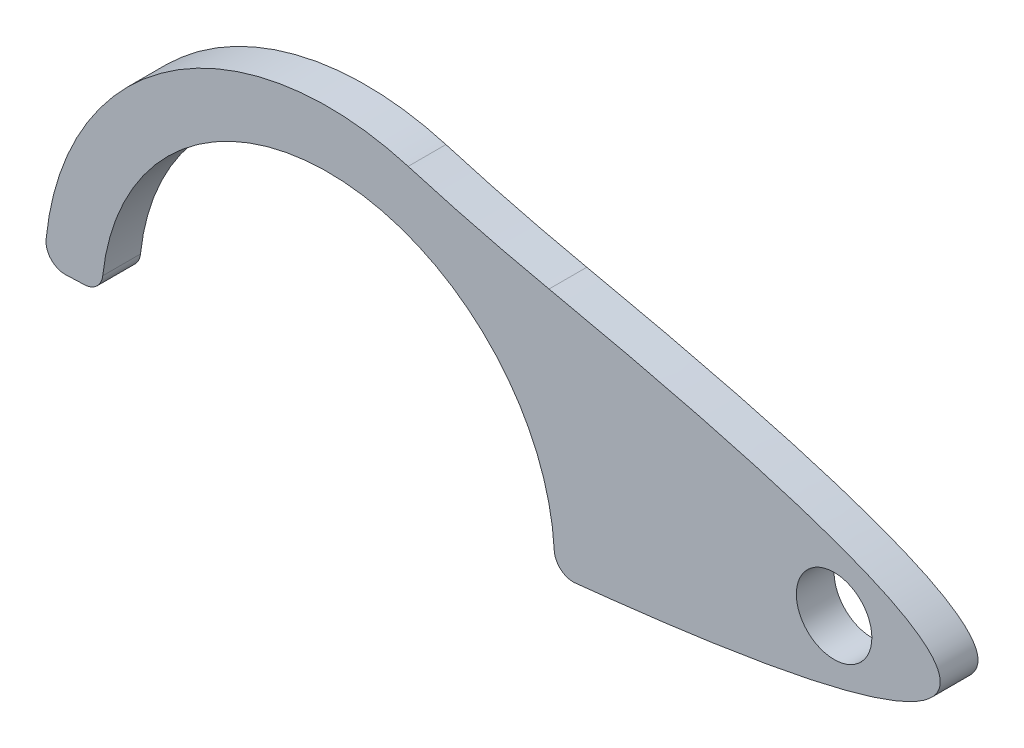
ISO-10303-21;
HEADER;
FILE_DESCRIPTION(('STEP AP214'),'2;1');
FILE_NAME('part.step','',(''),(''),'','','');
FILE_SCHEMA(('AUTOMOTIVE_DESIGN { 1 0 10303 214 1 1 1 1 }'));
ENDSEC;
DATA;
#1=APPLICATION_CONTEXT('core data for automotive mechanical design processes');
#2=APPLICATION_PROTOCOL_DEFINITION('international standard','automotive_design',2000,#1);
#3=PRODUCT_CONTEXT('',#1,'mechanical');
#4=PRODUCT('Part','Part','',(#3));
#5=PRODUCT_RELATED_PRODUCT_CATEGORY('part','',(#4));
#6=PRODUCT_DEFINITION_FORMATION('','',#4);
#7=PRODUCT_DEFINITION_CONTEXT('part definition',#1,'design');
#8=PRODUCT_DEFINITION('design','',#6,#7);
#9=PRODUCT_DEFINITION_SHAPE('','',#8);
#10=(LENGTH_UNIT() NAMED_UNIT(*) SI_UNIT(.MILLI.,.METRE.));
#11=(NAMED_UNIT(*) PLANE_ANGLE_UNIT() SI_UNIT($,.RADIAN.));
#12=(NAMED_UNIT(*) SI_UNIT($,.STERADIAN.) SOLID_ANGLE_UNIT());
#13=UNCERTAINTY_MEASURE_WITH_UNIT(LENGTH_MEASURE(1.E-05),#10,'distance_accuracy_value','');
#14=(GEOMETRIC_REPRESENTATION_CONTEXT(3) GLOBAL_UNCERTAINTY_ASSIGNED_CONTEXT((#13)) GLOBAL_UNIT_ASSIGNED_CONTEXT((#10,
#11,#12)) REPRESENTATION_CONTEXT('',''));
#15=CARTESIAN_POINT('',(0.,0.,0.));
#16=DIRECTION('',(0.,0.,1.));
#17=DIRECTION('',(1.,0.,0.));
#18=AXIS2_PLACEMENT_3D('',#15,#16,#17);
#19=CARTESIAN_POINT('',(6.35374235912783,13.5878606864298,2.));
#20=CARTESIAN_POINT('',(53.7396310244837,4.25584160131257,2.));
#21=CARTESIAN_POINT('',(14.9997289989865,-0.0901662739814048,2.));
#22=B_SPLINE_CURVE_WITH_KNOTS('',2,(#19,#20,#21),.UNSPECIFIED.,.F.,.F.,(3,3),(0.,1.),.UNSPECIFIED.);
#23=DIRECTION('',(0.,0.,-1.));
#24=VECTOR('',#23,1.);
#25=SURFACE_OF_LINEAR_EXTRUSION('',#22,#24);
#26=CARTESIAN_POINT('',(6.35374235912783,13.5878606864298,0.));
#27=CARTESIAN_POINT('',(53.7396310244837,4.25584160131257,0.));
#28=CARTESIAN_POINT('',(14.9997289989865,-0.0901662739814048,0.));
#29=B_SPLINE_CURVE_WITH_KNOTS('',2,(#26,#27,#28),.UNSPECIFIED.,.F.,.F.,(3,3),(0.,1.),.UNSPECIFIED.);
#30=CARTESIAN_POINT('',(11.7064313687259,12.4910088121295,0.));
#31=VERTEX_POINT('',#30);
#32=CARTESIAN_POINT('',(14.9997289989865,-0.0901662739814051,0.));
#33=VERTEX_POINT('',#32);
#34=EDGE_CURVE('E174',#31,#33,#29,.T.);
#35=ORIENTED_EDGE('',*,*,#34,.F.);
#36=DIRECTION('',(0.,0.,-1.));
#37=VECTOR('',#36,1.);
#38=CARTESIAN_POINT('',(11.7064313687292,12.4910088121288,0.));
#39=LINE('',#38,#37);
#40=CARTESIAN_POINT('',(11.7064313687259,12.4910088121295,2.));
#41=VERTEX_POINT('',#40);
#42=EDGE_CURVE('E49',#31,#41,#39,.F.);
#43=ORIENTED_EDGE('',*,*,#42,.T.);
#44=CARTESIAN_POINT('',(14.9997289989865,-0.0901662739814051,2.));
#45=VERTEX_POINT('',#44);
#46=EDGE_CURVE('E101',#41,#45,#22,.T.);
#47=ORIENTED_EDGE('',*,*,#46,.T.);
#48=DIRECTION('',(0.,0.,-1.));
#49=VECTOR('',#48,1.);
#50=CARTESIAN_POINT('',(14.9997289989865,-0.0901662739814051,2.));
#51=LINE('',#50,#49);
#52=EDGE_CURVE('E104',#45,#33,#51,.T.);
#53=ORIENTED_EDGE('',*,*,#52,.T.);
#54=EDGE_LOOP('',(#35,#43,#47,#53));
#55=FACE_BOUND('',#54,.T.);
#56=ADVANCED_FACE('F34',(#55),#25,.T.);
#57=CARTESIAN_POINT('',(0.,0.,2.));
#58=DIRECTION('',(0.,0.,-1.));
#59=DIRECTION('',(-1.,0.,0.));
#60=AXIS2_PLACEMENT_3D('',#57,#58,#59);
#61=CYLINDRICAL_SURFACE('',#60,15.);
#62=CARTESIAN_POINT('',(0.,0.,2.));
#63=DIRECTION('',(0.,0.,1.));
#64=DIRECTION('',(1.,0.,0.));
#65=AXIS2_PLACEMENT_3D('',#62,#63,#64);
#66=CIRCLE('',#65,15.);
#67=CARTESIAN_POINT('',(4.24517189125964,14.3867479165258,2.));
#68=VERTEX_POINT('',#67);
#69=CARTESIAN_POINT('',(-14.9303838398989,1.44348134497323,2.));
#70=VERTEX_POINT('',#69);
#71=EDGE_CURVE('E107',#68,#70,#66,.T.);
#72=ORIENTED_EDGE('',*,*,#71,.F.);
#73=DIRECTION('',(0.,0.,-1.));
#74=VECTOR('',#73,1.);
#75=CARTESIAN_POINT('',(4.24517189125964,14.3867479165258,2.));
#76=LINE('',#75,#74);
#77=CARTESIAN_POINT('',(4.24517189125964,14.3867479165258,0.));
#78=VERTEX_POINT('',#77);
#79=EDGE_CURVE('E160',#68,#78,#76,.T.);
#80=ORIENTED_EDGE('',*,*,#79,.T.);
#81=CARTESIAN_POINT('',(0.,0.,0.));
#82=DIRECTION('',(0.,0.,1.));
#83=DIRECTION('',(1.,0.,0.));
#84=AXIS2_PLACEMENT_3D('',#81,#82,#83);
#85=CIRCLE('',#84,15.);
#86=CARTESIAN_POINT('',(-14.9303838398989,1.44348134497323,0.));
#87=VERTEX_POINT('',#86);
#88=EDGE_CURVE('E167',#78,#87,#85,.T.);
#89=ORIENTED_EDGE('',*,*,#88,.T.);
#90=DIRECTION('',(0.,0.,-1.));
#91=VECTOR('',#90,1.);
#92=CARTESIAN_POINT('',(-14.9303838398989,1.44348134497323,2.));
#93=LINE('',#92,#91);
#94=EDGE_CURVE('E157',#87,#70,#93,.F.);
#95=ORIENTED_EDGE('',*,*,#94,.T.);
#96=EDGE_LOOP('',(#72,#80,#89,#95));
#97=FACE_BOUND('',#96,.T.);
#98=ADVANCED_FACE('F166',(#97),#61,.T.);
#99=CARTESIAN_POINT('',(-0.0327826563408831,0.870245535865194,2.));
#100=DIRECTION('',(-0.0376438823641468,0.999291217874226,0.));
#101=DIRECTION('',(-0.999291217874226,-0.0376438823641468,0.));
#102=AXIS2_PLACEMENT_3D('',#99,#100,#101);
#103=PLANE('',#102);
#104=DIRECTION('',(0.999291217874226,0.0376438823641468,0.));
#105=VECTOR('',#104,1.);
#106=CARTESIAN_POINT('',(-0.0327826563408831,0.870245535865194,0.));
#107=LINE('',#106,#105);
#108=CARTESIAN_POINT('',(-13.8973810348748,0.347958037434119,0.));
#109=VERTEX_POINT('',#108);
#110=CARTESIAN_POINT('',(-12.8883397764657,0.385969209505588,0.));
#111=VERTEX_POINT('',#110);
#112=EDGE_CURVE('E173',#109,#111,#107,.T.);
#113=ORIENTED_EDGE('',*,*,#112,.T.);
#114=DIRECTION('',(0.,0.,1.));
#115=VECTOR('',#114,1.);
#116=CARTESIAN_POINT('',(-12.8883397764657,0.385969209505588,2.));
#117=LINE('',#116,#115);
#118=CARTESIAN_POINT('',(-12.8883397764657,0.385969209505588,2.));
#119=VERTEX_POINT('',#118);
#120=EDGE_CURVE('E155',#111,#119,#117,.T.);
#121=ORIENTED_EDGE('',*,*,#120,.T.);
#122=DIRECTION('',(0.999291217874226,0.0376438823641468,0.));
#123=VECTOR('',#122,1.);
#124=CARTESIAN_POINT('',(-0.0327826563408831,0.870245535865194,2.));
#125=LINE('',#124,#123);
#126=CARTESIAN_POINT('',(-13.8973810348748,0.347958037434119,2.));
#127=VERTEX_POINT('',#126);
#128=EDGE_CURVE('E218',#127,#119,#125,.T.);
#129=ORIENTED_EDGE('',*,*,#128,.F.);
#130=DIRECTION('',(0.,0.,-1.));
#131=VECTOR('',#130,1.);
#132=CARTESIAN_POINT('',(-13.8973810348748,0.347958037434119,2.));
#133=LINE('',#132,#131);
#134=EDGE_CURVE('E152',#127,#109,#133,.T.);
#135=ORIENTED_EDGE('',*,*,#134,.T.);
#136=EDGE_LOOP('',(#113,#121,#129,#135));
#137=FACE_BOUND('',#136,.T.);
#138=ADVANCED_FACE('F204',(#137),#103,.F.);
#139=CARTESIAN_POINT('',(0.,0.,2.));
#140=DIRECTION('',(0.,0.,-1.));
#141=DIRECTION('',(-1.,0.,0.));
#142=AXIS2_PLACEMENT_3D('',#139,#140,#141);
#143=CYLINDRICAL_SURFACE('',#142,12.);
#144=CARTESIAN_POINT('',(0.,0.,0.));
#145=DIRECTION('',(0.,0.,1.));
#146=DIRECTION('',(1.,0.,0.));
#147=AXIS2_PLACEMENT_3D('',#144,#145,#146);
#148=CIRCLE('',#147,12.);
#149=CARTESIAN_POINT('',(11.982856899948,0.641202398130928,0.));
#150=VERTEX_POINT('',#149);
#151=CARTESIAN_POINT('',(-11.9316772235352,1.27870193296598,0.));
#152=VERTEX_POINT('',#151);
#153=EDGE_CURVE('E177',#150,#152,#148,.T.);
#154=ORIENTED_EDGE('',*,*,#153,.F.);
#155=DIRECTION('',(0.,0.,-1.));
#156=VECTOR('',#155,1.);
#157=CARTESIAN_POINT('',(11.982856899948,0.641202398130929,2.));
#158=LINE('',#157,#156);
#159=CARTESIAN_POINT('',(11.982856899948,0.641202398130928,2.));
#160=VERTEX_POINT('',#159);
#161=EDGE_CURVE('E145',#150,#160,#158,.F.);
#162=ORIENTED_EDGE('',*,*,#161,.T.);
#163=CARTESIAN_POINT('',(0.,0.,2.));
#164=DIRECTION('',(0.,0.,1.));
#165=DIRECTION('',(1.,0.,0.));
#166=AXIS2_PLACEMENT_3D('',#163,#164,#165);
#167=CIRCLE('',#166,12.);
#168=CARTESIAN_POINT('',(-11.9316772235352,1.27870193296598,2.));
#169=VERTEX_POINT('',#168);
#170=EDGE_CURVE('E121',#160,#169,#167,.T.);
#171=ORIENTED_EDGE('',*,*,#170,.T.);
#172=DIRECTION('',(0.,0.,-1.));
#173=VECTOR('',#172,1.);
#174=CARTESIAN_POINT('',(-11.9316772235352,1.27870193296598,2.));
#175=LINE('',#174,#173);
#176=EDGE_CURVE('E142',#169,#152,#175,.T.);
#177=ORIENTED_EDGE('',*,*,#176,.T.);
#178=EDGE_LOOP('',(#154,#162,#171,#177));
#179=FACE_BOUND('',#178,.T.);
#180=ADVANCED_FACE('F196',(#179),#143,.F.);
#181=CARTESIAN_POINT('',(0.187771210601942,-1.71340317060258,2.));
#182=DIRECTION('',(-0.108937414245944,0.994048610369437,0.));
#183=DIRECTION('',(-0.994048610369437,-0.108937414245944,0.));
#184=AXIS2_PLACEMENT_3D('',#181,#182,#183);
#185=PLANE('',#184);
#186=DIRECTION('',(0.994048610369436,0.108937414245944,0.));
#187=VECTOR('',#186,1.);
#188=CARTESIAN_POINT('',(0.187771210601942,-1.71340317060258,2.));
#189=LINE('',#188,#187);
#190=CARTESIAN_POINT('',(13.0903657225229,-0.299412679060931,2.));
#191=VERTEX_POINT('',#190);
#192=EDGE_CURVE('E111',#191,#45,#189,.T.);
#193=ORIENTED_EDGE('',*,*,#192,.F.);
#194=DIRECTION('',(0.,0.,1.));
#195=VECTOR('',#194,1.);
#196=CARTESIAN_POINT('',(13.0903657225229,-0.299412679060931,0.));
#197=LINE('',#196,#195);
#198=CARTESIAN_POINT('',(13.0903657225229,-0.299412679060931,0.));
#199=VERTEX_POINT('',#198);
#200=EDGE_CURVE('E127',#191,#199,#197,.F.);
#201=ORIENTED_EDGE('',*,*,#200,.T.);
#202=DIRECTION('',(0.994048610369436,0.108937414245944,0.));
#203=VECTOR('',#202,1.);
#204=CARTESIAN_POINT('',(0.187771210601942,-1.71340317060258,0.));
#205=LINE('',#204,#203);
#206=EDGE_CURVE('E126',#199,#33,#205,.T.);
#207=ORIENTED_EDGE('',*,*,#206,.T.);
#208=ORIENTED_EDGE('',*,*,#52,.F.);
#209=EDGE_LOOP('',(#193,#201,#207,#208));
#210=FACE_BOUND('',#209,.T.);
#211=ADVANCED_FACE('F124',(#210),#185,.F.);
#212=CARTESIAN_POINT('',(26.8036076870909,5.04867041357118,2.));
#213=DIRECTION('',(0.,0.,-1.));
#214=DIRECTION('',(-1.,0.,0.));
#215=AXIS2_PLACEMENT_3D('',#212,#213,#214);
#216=CYLINDRICAL_SURFACE('',#215,2.);
#217=CARTESIAN_POINT('',(26.8036076870909,5.04867041357118,2.));
#218=DIRECTION('',(0.,0.,1.));
#219=DIRECTION('',(1.,0.,0.));
#220=AXIS2_PLACEMENT_3D('',#217,#218,#219);
#221=CIRCLE('',#220,2.);
#222=CARTESIAN_POINT('',(28.8036076870909,5.04867041357118,2.));
#223=VERTEX_POINT('',#222);
#224=EDGE_CURVE('E120',#223,#223,#221,.T.);
#225=ORIENTED_EDGE('',*,*,#224,.T.);
#226=EDGE_LOOP('',(#225));
#227=FACE_BOUND('',#226,.T.);
#228=CARTESIAN_POINT('',(26.8036076870909,5.04867041357118,0.));
#229=DIRECTION('',(0.,0.,1.));
#230=DIRECTION('',(1.,0.,0.));
#231=AXIS2_PLACEMENT_3D('',#228,#229,#230);
#232=CIRCLE('',#231,2.);
#233=CARTESIAN_POINT('',(28.8036076870909,5.04867041357118,0.));
#234=VERTEX_POINT('',#233);
#235=EDGE_CURVE('E108',#234,#234,#232,.T.);
#236=ORIENTED_EDGE('',*,*,#235,.F.);
#237=EDGE_LOOP('',(#236));
#238=FACE_BOUND('',#237,.T.);
#239=ADVANCED_FACE('F187',(#227,#238),#216,.F.);
#240=CARTESIAN_POINT('',(0.,0.,2.));
#241=DIRECTION('',(0.,0.,1.));
#242=DIRECTION('',(1.,0.,0.));
#243=AXIS2_PLACEMENT_3D('',#240,#241,#242);
#244=PLANE('',#243);
#245=ORIENTED_EDGE('',*,*,#170,.F.);
#246=CARTESIAN_POINT('',(12.981428308277,0.694635931308506,2.));
#247=DIRECTION('',(0.,0.,1.));
#248=DIRECTION('',(1.,0.,0.));
#249=AXIS2_PLACEMENT_3D('',#246,#247,#248);
#250=CIRCLE('',#249,1.);
#251=EDGE_CURVE('E116',#160,#191,#250,.T.);
#252=ORIENTED_EDGE('',*,*,#251,.T.);
#253=ORIENTED_EDGE('',*,*,#192,.T.);
#254=ORIENTED_EDGE('',*,*,#46,.F.);
#255=CARTESIAN_POINT('',(32.8293292924079,111.257517221133,2.));
#256=DIRECTION('',(0.,0.,1.));
#257=DIRECTION('',(1.,0.,0.));
#258=AXIS2_PLACEMENT_3D('',#255,#256,#257);
#259=CIRCLE('',#258,101.);
#260=EDGE_CURVE('E11',#41,#68,#259,.F.);
#261=ORIENTED_EDGE('',*,*,#260,.T.);
#262=ORIENTED_EDGE('',*,*,#71,.T.);
#263=CARTESIAN_POINT('',(-13.935024917239,1.34724925530835,2.));
#264=DIRECTION('',(0.,0.,1.));
#265=DIRECTION('',(1.,0.,0.));
#266=AXIS2_PLACEMENT_3D('',#263,#264,#265);
#267=CIRCLE('',#266,1.);
#268=EDGE_CURVE('E147',#70,#127,#267,.T.);
#269=ORIENTED_EDGE('',*,*,#268,.T.);
#270=ORIENTED_EDGE('',*,*,#128,.T.);
#271=CARTESIAN_POINT('',(-12.9259836588298,1.38526042737981,2.));
#272=DIRECTION('',(0.,0.,1.));
#273=DIRECTION('',(1.,0.,0.));
#274=AXIS2_PLACEMENT_3D('',#271,#272,#273);
#275=CIRCLE('',#274,1.);
#276=EDGE_CURVE('E149',#119,#169,#275,.T.);
#277=ORIENTED_EDGE('',*,*,#276,.T.);
#278=EDGE_LOOP('',(#245,#252,#253,#254,#261,#262,#269,#270,#277));
#279=FACE_BOUND('',#278,.T.);
#280=ORIENTED_EDGE('',*,*,#224,.F.);
#281=EDGE_LOOP('',(#280));
#282=FACE_BOUND('',#281,.T.);
#283=ADVANCED_FACE('F113',(#279,#282),#244,.T.);
#284=CARTESIAN_POINT('',(0.,0.,0.));
#285=DIRECTION('',(0.,0.,1.));
#286=DIRECTION('',(1.,0.,0.));
#287=AXIS2_PLACEMENT_3D('',#284,#285,#286);
#288=PLANE('',#287);
#289=ORIENTED_EDGE('',*,*,#206,.F.);
#290=CARTESIAN_POINT('',(12.981428308277,0.694635931308506,0.));
#291=DIRECTION('',(0.,0.,1.));
#292=DIRECTION('',(1.,0.,0.));
#293=AXIS2_PLACEMENT_3D('',#290,#291,#292);
#294=CIRCLE('',#293,1.);
#295=EDGE_CURVE('E140',#199,#150,#294,.F.);
#296=ORIENTED_EDGE('',*,*,#295,.T.);
#297=ORIENTED_EDGE('',*,*,#153,.T.);
#298=CARTESIAN_POINT('',(-12.9259836588298,1.38526042737981,0.));
#299=DIRECTION('',(0.,0.,1.));
#300=DIRECTION('',(1.,0.,0.));
#301=AXIS2_PLACEMENT_3D('',#298,#299,#300);
#302=CIRCLE('',#301,1.);
#303=EDGE_CURVE('E138',#152,#111,#302,.F.);
#304=ORIENTED_EDGE('',*,*,#303,.T.);
#305=ORIENTED_EDGE('',*,*,#112,.F.);
#306=CARTESIAN_POINT('',(-13.935024917239,1.34724925530835,0.));
#307=DIRECTION('',(0.,0.,1.));
#308=DIRECTION('',(1.,0.,0.));
#309=AXIS2_PLACEMENT_3D('',#306,#307,#308);
#310=CIRCLE('',#309,1.);
#311=EDGE_CURVE('E129',#109,#87,#310,.F.);
#312=ORIENTED_EDGE('',*,*,#311,.T.);
#313=ORIENTED_EDGE('',*,*,#88,.F.);
#314=CARTESIAN_POINT('',(32.8293292924079,111.257517221133,0.));
#315=DIRECTION('',(0.,0.,1.));
#316=DIRECTION('',(1.,0.,0.));
#317=AXIS2_PLACEMENT_3D('',#314,#315,#316);
#318=CIRCLE('',#317,101.);
#319=EDGE_CURVE('E42',#78,#31,#318,.T.);
#320=ORIENTED_EDGE('',*,*,#319,.T.);
#321=ORIENTED_EDGE('',*,*,#34,.T.);
#322=EDGE_LOOP('',(#289,#296,#297,#304,#305,#312,#313,#320,#321));
#323=FACE_BOUND('',#322,.T.);
#324=ORIENTED_EDGE('',*,*,#235,.T.);
#325=EDGE_LOOP('',(#324));
#326=FACE_BOUND('',#325,.T.);
#327=ADVANCED_FACE('F169',(#323,#326),#288,.F.);
#328=CARTESIAN_POINT('',(12.981428308277,0.694635931308506,2.));
#329=DIRECTION('',(0.,0.,-1.));
#330=DIRECTION('',(-1.,0.,0.));
#331=AXIS2_PLACEMENT_3D('',#328,#329,#330);
#332=CYLINDRICAL_SURFACE('',#331,1.);
#333=ORIENTED_EDGE('',*,*,#251,.F.);
#334=ORIENTED_EDGE('',*,*,#161,.F.);
#335=ORIENTED_EDGE('',*,*,#295,.F.);
#336=ORIENTED_EDGE('',*,*,#200,.F.);
#337=EDGE_LOOP('',(#333,#334,#335,#336));
#338=FACE_BOUND('',#337,.T.);
#339=ADVANCED_FACE('F208',(#338),#332,.T.);
#340=CARTESIAN_POINT('',(-12.9259836588298,1.38526042737981,2.));
#341=DIRECTION('',(0.,0.,-1.));
#342=DIRECTION('',(-1.,0.,0.));
#343=AXIS2_PLACEMENT_3D('',#340,#341,#342);
#344=CYLINDRICAL_SURFACE('',#343,1.);
#345=ORIENTED_EDGE('',*,*,#276,.F.);
#346=ORIENTED_EDGE('',*,*,#120,.F.);
#347=ORIENTED_EDGE('',*,*,#303,.F.);
#348=ORIENTED_EDGE('',*,*,#176,.F.);
#349=EDGE_LOOP('',(#345,#346,#347,#348));
#350=FACE_BOUND('',#349,.T.);
#351=ADVANCED_FACE('F228',(#350),#344,.T.);
#352=CARTESIAN_POINT('',(-13.935024917239,1.34724925530835,2.));
#353=DIRECTION('',(0.,0.,-1.));
#354=DIRECTION('',(-1.,0.,0.));
#355=AXIS2_PLACEMENT_3D('',#352,#353,#354);
#356=CYLINDRICAL_SURFACE('',#355,1.);
#357=ORIENTED_EDGE('',*,*,#268,.F.);
#358=ORIENTED_EDGE('',*,*,#94,.F.);
#359=ORIENTED_EDGE('',*,*,#311,.F.);
#360=ORIENTED_EDGE('',*,*,#134,.F.);
#361=EDGE_LOOP('',(#357,#358,#359,#360));
#362=FACE_BOUND('',#361,.T.);
#363=ADVANCED_FACE('F235',(#362),#356,.T.);
#364=CARTESIAN_POINT('',(32.8293292924079,111.257517221133,1.));
#365=DIRECTION('',(0.,0.,-1.));
#366=DIRECTION('',(-1.,0.,0.));
#367=AXIS2_PLACEMENT_3D('',#364,#365,#366);
#368=CYLINDRICAL_SURFACE('',#367,101.);
#369=ORIENTED_EDGE('',*,*,#260,.F.);
#370=ORIENTED_EDGE('',*,*,#42,.F.);
#371=ORIENTED_EDGE('',*,*,#319,.F.);
#372=ORIENTED_EDGE('',*,*,#79,.F.);
#373=EDGE_LOOP('',(#369,#370,#371,#372));
#374=FACE_BOUND('',#373,.T.);
#375=ADVANCED_FACE('F36',(#374),#368,.F.);
#376=CLOSED_SHELL('',(#56,#98,#138,#180,#211,#239,#283,#327,#339,#351,#363,#375));
#377=MANIFOLD_SOLID_BREP('B2',#376);
#378=ADVANCED_BREP_SHAPE_REPRESENTATION('',(#18,#377),#14);
#379=SHAPE_DEFINITION_REPRESENTATION(#9,#378);
ENDSEC;
END-ISO-10303-21;
